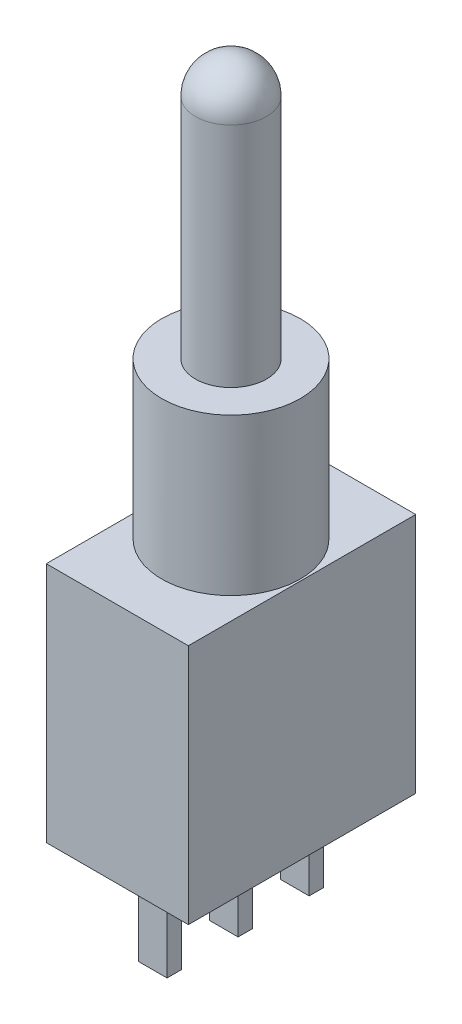
ISO-10303-21;
HEADER;
FILE_DESCRIPTION(('STEP AP214'),'2;1');
FILE_NAME('part.step','',(''),(''),'','','');
FILE_SCHEMA(('AUTOMOTIVE_DESIGN { 1 0 10303 214 1 1 1 1 }'));
ENDSEC;
DATA;
#1=APPLICATION_CONTEXT('core data for automotive mechanical design processes');
#2=APPLICATION_PROTOCOL_DEFINITION('international standard','automotive_design',2000,#1);
#3=PRODUCT_CONTEXT('',#1,'mechanical');
#4=PRODUCT('Part','Part','',(#3));
#5=PRODUCT_RELATED_PRODUCT_CATEGORY('part','',(#4));
#6=PRODUCT_DEFINITION_FORMATION('','',#4);
#7=PRODUCT_DEFINITION_CONTEXT('part definition',#1,'design');
#8=PRODUCT_DEFINITION('design','',#6,#7);
#9=PRODUCT_DEFINITION_SHAPE('','',#8);
#10=(LENGTH_UNIT() NAMED_UNIT(*) SI_UNIT(.MILLI.,.METRE.));
#11=(NAMED_UNIT(*) PLANE_ANGLE_UNIT() SI_UNIT($,.RADIAN.));
#12=(NAMED_UNIT(*) SI_UNIT($,.STERADIAN.) SOLID_ANGLE_UNIT());
#13=UNCERTAINTY_MEASURE_WITH_UNIT(LENGTH_MEASURE(1.E-05),#10,'distance_accuracy_value','');
#14=(GEOMETRIC_REPRESENTATION_CONTEXT(3) GLOBAL_UNCERTAINTY_ASSIGNED_CONTEXT((#13)) GLOBAL_UNIT_ASSIGNED_CONTEXT((#10,
#11,#12)) REPRESENTATION_CONTEXT('',''));
#15=CARTESIAN_POINT('',(0.,0.,0.));
#16=DIRECTION('',(0.,0.,1.));
#17=DIRECTION('',(1.,0.,0.));
#18=AXIS2_PLACEMENT_3D('',#15,#16,#17);
#19=CARTESIAN_POINT('',(0.,0.,0.));
#20=DIRECTION('',(0.,-1.,0.));
#21=DIRECTION('',(0.,0.,-1.));
#22=AXIS2_PLACEMENT_3D('',#19,#20,#21);
#23=PLANE('',#22);
#24=DIRECTION('',(0.,0.,-1.));
#25=VECTOR('',#24,1.);
#26=CARTESIAN_POINT('',(-2.54,0.,4.064));
#27=LINE('',#26,#25);
#28=CARTESIAN_POINT('',(-2.54,0.,4.064));
#29=VERTEX_POINT('',#28);
#30=CARTESIAN_POINT('',(-2.54,0.,-4.064));
#31=VERTEX_POINT('',#30);
#32=EDGE_CURVE('E235',#29,#31,#27,.T.);
#33=ORIENTED_EDGE('',*,*,#32,.T.);
#34=DIRECTION('',(1.,0.,0.));
#35=VECTOR('',#34,1.);
#36=CARTESIAN_POINT('',(-2.54,0.,-4.064));
#37=LINE('',#36,#35);
#38=CARTESIAN_POINT('',(2.54,0.,-4.064));
#39=VERTEX_POINT('',#38);
#40=EDGE_CURVE('E250',#31,#39,#37,.T.);
#41=ORIENTED_EDGE('',*,*,#40,.T.);
#42=DIRECTION('',(0.,0.,-1.));
#43=VECTOR('',#42,1.);
#44=CARTESIAN_POINT('',(2.54,0.,4.064));
#45=LINE('',#44,#43);
#46=CARTESIAN_POINT('',(2.54,0.,4.064));
#47=VERTEX_POINT('',#46);
#48=EDGE_CURVE('E253',#47,#39,#45,.T.);
#49=ORIENTED_EDGE('',*,*,#48,.F.);
#50=DIRECTION('',(1.,0.,0.));
#51=VECTOR('',#50,1.);
#52=CARTESIAN_POINT('',(-2.54,0.,4.064));
#53=LINE('',#52,#51);
#54=EDGE_CURVE('E240',#29,#47,#53,.T.);
#55=ORIENTED_EDGE('',*,*,#54,.F.);
#56=EDGE_LOOP('',(#33,#41,#49,#55));
#57=FACE_BOUND('',#56,.T.);
#58=DIRECTION('',(1.,0.,0.));
#59=VECTOR('',#58,1.);
#60=CARTESIAN_POINT('',(0.508,0.,-0.254));
#61=LINE('',#60,#59);
#62=CARTESIAN_POINT('',(-0.508,0.,-0.254));
#63=VERTEX_POINT('',#62);
#64=CARTESIAN_POINT('',(0.508,0.,-0.254));
#65=VERTEX_POINT('',#64);
#66=EDGE_CURVE('E217',#63,#65,#61,.T.);
#67=ORIENTED_EDGE('',*,*,#66,.F.);
#68=DIRECTION('',(0.,0.,-1.));
#69=VECTOR('',#68,1.);
#70=CARTESIAN_POINT('',(-0.508,0.,0.254));
#71=LINE('',#70,#69);
#72=CARTESIAN_POINT('',(-0.508,0.,0.254));
#73=VERTEX_POINT('',#72);
#74=EDGE_CURVE('E203',#73,#63,#71,.T.);
#75=ORIENTED_EDGE('',*,*,#74,.F.);
#76=DIRECTION('',(-1.,0.,0.));
#77=VECTOR('',#76,1.);
#78=CARTESIAN_POINT('',(0.508,0.,0.254));
#79=LINE('',#78,#77);
#80=CARTESIAN_POINT('',(0.508,0.,0.254));
#81=VERTEX_POINT('',#80);
#82=EDGE_CURVE('E208',#81,#73,#79,.T.);
#83=ORIENTED_EDGE('',*,*,#82,.F.);
#84=DIRECTION('',(0.,0.,1.));
#85=VECTOR('',#84,1.);
#86=CARTESIAN_POINT('',(0.508,0.,0.254));
#87=LINE('',#86,#85);
#88=EDGE_CURVE('E219',#65,#81,#87,.T.);
#89=ORIENTED_EDGE('',*,*,#88,.F.);
#90=EDGE_LOOP('',(#67,#75,#83,#89));
#91=FACE_BOUND('',#90,.T.);
#92=DIRECTION('',(1.,0.,0.));
#93=VECTOR('',#92,1.);
#94=CARTESIAN_POINT('',(0.508,0.,-2.794));
#95=LINE('',#94,#93);
#96=CARTESIAN_POINT('',(-0.508,0.,-2.794));
#97=VERTEX_POINT('',#96);
#98=CARTESIAN_POINT('',(0.508,0.,-2.794));
#99=VERTEX_POINT('',#98);
#100=EDGE_CURVE('E175',#97,#99,#95,.T.);
#101=ORIENTED_EDGE('',*,*,#100,.F.);
#102=DIRECTION('',(0.,0.,-1.));
#103=VECTOR('',#102,1.);
#104=CARTESIAN_POINT('',(-0.508,0.,-2.286));
#105=LINE('',#104,#103);
#106=CARTESIAN_POINT('',(-0.508,0.,-2.286));
#107=VERTEX_POINT('',#106);
#108=EDGE_CURVE('E172',#107,#97,#105,.T.);
#109=ORIENTED_EDGE('',*,*,#108,.F.);
#110=DIRECTION('',(-1.,0.,0.));
#111=VECTOR('',#110,1.);
#112=CARTESIAN_POINT('',(0.508,0.,-2.286));
#113=LINE('',#112,#111);
#114=CARTESIAN_POINT('',(0.508,0.,-2.286));
#115=VERTEX_POINT('',#114);
#116=EDGE_CURVE('E184',#115,#107,#113,.T.);
#117=ORIENTED_EDGE('',*,*,#116,.F.);
#118=DIRECTION('',(0.,0.,1.));
#119=VECTOR('',#118,1.);
#120=CARTESIAN_POINT('',(0.508,0.,-2.286));
#121=LINE('',#120,#119);
#122=EDGE_CURVE('E192',#99,#115,#121,.T.);
#123=ORIENTED_EDGE('',*,*,#122,.F.);
#124=EDGE_LOOP('',(#101,#109,#117,#123));
#125=FACE_BOUND('',#124,.T.);
#126=DIRECTION('',(1.,0.,0.));
#127=VECTOR('',#126,1.);
#128=CARTESIAN_POINT('',(0.508,0.,2.286));
#129=LINE('',#128,#127);
#130=CARTESIAN_POINT('',(-0.508,0.,2.286));
#131=VERTEX_POINT('',#130);
#132=CARTESIAN_POINT('',(0.508,0.,2.286));
#133=VERTEX_POINT('',#132);
#134=EDGE_CURVE('E304',#131,#133,#129,.T.);
#135=ORIENTED_EDGE('',*,*,#134,.F.);
#136=DIRECTION('',(0.,0.,-1.));
#137=VECTOR('',#136,1.);
#138=CARTESIAN_POINT('',(-0.508,0.,2.286));
#139=LINE('',#138,#137);
#140=CARTESIAN_POINT('',(-0.508,0.,2.794));
#141=VERTEX_POINT('',#140);
#142=EDGE_CURVE('E170',#141,#131,#139,.T.);
#143=ORIENTED_EDGE('',*,*,#142,.F.);
#144=DIRECTION('',(-1.,0.,0.));
#145=VECTOR('',#144,1.);
#146=CARTESIAN_POINT('',(0.508,0.,2.794));
#147=LINE('',#146,#145);
#148=CARTESIAN_POINT('',(0.508,0.,2.794));
#149=VERTEX_POINT('',#148);
#150=EDGE_CURVE('E166',#149,#141,#147,.T.);
#151=ORIENTED_EDGE('',*,*,#150,.F.);
#152=DIRECTION('',(0.,0.,1.));
#153=VECTOR('',#152,1.);
#154=CARTESIAN_POINT('',(0.508,0.,2.286));
#155=LINE('',#154,#153);
#156=EDGE_CURVE('E306',#133,#149,#155,.T.);
#157=ORIENTED_EDGE('',*,*,#156,.F.);
#158=EDGE_LOOP('',(#135,#143,#151,#157));
#159=FACE_BOUND('',#158,.T.);
#160=ADVANCED_FACE('F33',(#57,#91,#125,#159),#23,.T.);
#161=CARTESIAN_POINT('',(-2.54,8.636,4.064));
#162=DIRECTION('',(-1.,0.,0.));
#163=DIRECTION('',(0.,0.,1.));
#164=AXIS2_PLACEMENT_3D('',#161,#162,#163);
#165=PLANE('',#164);
#166=ORIENTED_EDGE('',*,*,#32,.F.);
#167=DIRECTION('',(0.,-1.,0.));
#168=VECTOR('',#167,1.);
#169=CARTESIAN_POINT('',(-2.54,8.636,4.064));
#170=LINE('',#169,#168);
#171=CARTESIAN_POINT('',(-2.54,8.636,4.064));
#172=VERTEX_POINT('',#171);
#173=EDGE_CURVE('E257',#172,#29,#170,.T.);
#174=ORIENTED_EDGE('',*,*,#173,.F.);
#175=DIRECTION('',(0.,0.,-1.));
#176=VECTOR('',#175,1.);
#177=CARTESIAN_POINT('',(-2.54,8.636,4.064));
#178=LINE('',#177,#176);
#179=CARTESIAN_POINT('',(-2.54,8.636,-4.064));
#180=VERTEX_POINT('',#179);
#181=EDGE_CURVE('E236',#172,#180,#178,.T.);
#182=ORIENTED_EDGE('',*,*,#181,.T.);
#183=DIRECTION('',(0.,-1.,0.));
#184=VECTOR('',#183,1.);
#185=CARTESIAN_POINT('',(-2.54,8.636,-4.064));
#186=LINE('',#185,#184);
#187=EDGE_CURVE('E247',#180,#31,#186,.T.);
#188=ORIENTED_EDGE('',*,*,#187,.T.);
#189=EDGE_LOOP('',(#166,#174,#182,#188));
#190=FACE_BOUND('',#189,.T.);
#191=ADVANCED_FACE('F280',(#190),#165,.T.);
#192=CARTESIAN_POINT('',(-2.54,8.636,4.064));
#193=DIRECTION('',(0.,0.,-1.));
#194=DIRECTION('',(-1.,0.,0.));
#195=AXIS2_PLACEMENT_3D('',#192,#193,#194);
#196=PLANE('',#195);
#197=ORIENTED_EDGE('',*,*,#54,.T.);
#198=DIRECTION('',(0.,-1.,0.));
#199=VECTOR('',#198,1.);
#200=CARTESIAN_POINT('',(2.54,8.636,4.064));
#201=LINE('',#200,#199);
#202=CARTESIAN_POINT('',(2.54,8.636,4.064));
#203=VERTEX_POINT('',#202);
#204=EDGE_CURVE('E259',#203,#47,#201,.T.);
#205=ORIENTED_EDGE('',*,*,#204,.F.);
#206=DIRECTION('',(1.,0.,0.));
#207=VECTOR('',#206,1.);
#208=CARTESIAN_POINT('',(-2.54,8.636,4.064));
#209=LINE('',#208,#207);
#210=EDGE_CURVE('E245',#172,#203,#209,.T.);
#211=ORIENTED_EDGE('',*,*,#210,.F.);
#212=ORIENTED_EDGE('',*,*,#173,.T.);
#213=EDGE_LOOP('',(#197,#205,#211,#212));
#214=FACE_BOUND('',#213,.T.);
#215=ADVANCED_FACE('F284',(#214),#196,.F.);
#216=CARTESIAN_POINT('',(2.54,8.636,4.064));
#217=DIRECTION('',(-1.,0.,0.));
#218=DIRECTION('',(0.,0.,1.));
#219=AXIS2_PLACEMENT_3D('',#216,#217,#218);
#220=PLANE('',#219);
#221=ORIENTED_EDGE('',*,*,#48,.T.);
#222=DIRECTION('',(0.,-1.,0.));
#223=VECTOR('',#222,1.);
#224=CARTESIAN_POINT('',(2.54,8.636,-4.064));
#225=LINE('',#224,#223);
#226=CARTESIAN_POINT('',(2.54,8.636,-4.064));
#227=VERTEX_POINT('',#226);
#228=EDGE_CURVE('E262',#227,#39,#225,.T.);
#229=ORIENTED_EDGE('',*,*,#228,.F.);
#230=DIRECTION('',(0.,0.,-1.));
#231=VECTOR('',#230,1.);
#232=CARTESIAN_POINT('',(2.54,8.636,4.064));
#233=LINE('',#232,#231);
#234=EDGE_CURVE('E243',#203,#227,#233,.T.);
#235=ORIENTED_EDGE('',*,*,#234,.F.);
#236=ORIENTED_EDGE('',*,*,#204,.T.);
#237=EDGE_LOOP('',(#221,#229,#235,#236));
#238=FACE_BOUND('',#237,.T.);
#239=ADVANCED_FACE('F289',(#238),#220,.F.);
#240=CARTESIAN_POINT('',(-2.54,8.636,-4.064));
#241=DIRECTION('',(0.,0.,-1.));
#242=DIRECTION('',(-1.,0.,0.));
#243=AXIS2_PLACEMENT_3D('',#240,#241,#242);
#244=PLANE('',#243);
#245=ORIENTED_EDGE('',*,*,#40,.F.);
#246=ORIENTED_EDGE('',*,*,#187,.F.);
#247=DIRECTION('',(1.,0.,0.));
#248=VECTOR('',#247,1.);
#249=CARTESIAN_POINT('',(-2.54,8.636,-4.064));
#250=LINE('',#249,#248);
#251=EDGE_CURVE('E239',#180,#227,#250,.T.);
#252=ORIENTED_EDGE('',*,*,#251,.T.);
#253=ORIENTED_EDGE('',*,*,#228,.T.);
#254=EDGE_LOOP('',(#245,#246,#252,#253));
#255=FACE_BOUND('',#254,.T.);
#256=ADVANCED_FACE('F272',(#255),#244,.T.);
#257=CARTESIAN_POINT('',(0.,8.636,0.));
#258=DIRECTION('',(0.,-1.,0.));
#259=DIRECTION('',(0.,0.,-1.));
#260=AXIS2_PLACEMENT_3D('',#257,#258,#259);
#261=PLANE('',#260);
#262=CARTESIAN_POINT('',(0.,8.636,0.));
#263=DIRECTION('',(0.,-1.,0.));
#264=DIRECTION('',(0.,0.,-1.));
#265=AXIS2_PLACEMENT_3D('',#262,#263,#264);
#266=CIRCLE('',#265,2.4765);
#267=CARTESIAN_POINT('',(0.,8.636,-2.4765));
#268=VERTEX_POINT('',#267);
#269=EDGE_CURVE('E41',#268,#268,#266,.F.);
#270=ORIENTED_EDGE('',*,*,#269,.F.);
#271=EDGE_LOOP('',(#270));
#272=FACE_BOUND('',#271,.T.);
#273=ORIENTED_EDGE('',*,*,#181,.F.);
#274=ORIENTED_EDGE('',*,*,#210,.T.);
#275=ORIENTED_EDGE('',*,*,#234,.T.);
#276=ORIENTED_EDGE('',*,*,#251,.F.);
#277=EDGE_LOOP('',(#273,#274,#275,#276));
#278=FACE_BOUND('',#277,.T.);
#279=ADVANCED_FACE('F269',(#272,#278),#261,.F.);
#280=CARTESIAN_POINT('',(0.,14.224,0.));
#281=DIRECTION('',(0.,-1.,0.));
#282=DIRECTION('',(0.,0.,-1.));
#283=AXIS2_PLACEMENT_3D('',#280,#281,#282);
#284=CYLINDRICAL_SURFACE('',#283,2.4765);
#285=CARTESIAN_POINT('',(0.,14.224,0.));
#286=DIRECTION('',(0.,1.,0.));
#287=DIRECTION('',(0.,0.,1.));
#288=AXIS2_PLACEMENT_3D('',#285,#286,#287);
#289=CIRCLE('',#288,2.4765);
#290=CARTESIAN_POINT('',(0.,14.224,2.4765));
#291=VERTEX_POINT('',#290);
#292=EDGE_CURVE('E232',#291,#291,#289,.T.);
#293=ORIENTED_EDGE('',*,*,#292,.F.);
#294=EDGE_LOOP('',(#293));
#295=FACE_BOUND('',#294,.T.);
#296=ORIENTED_EDGE('',*,*,#269,.T.);
#297=EDGE_LOOP('',(#296));
#298=FACE_BOUND('',#297,.T.);
#299=ADVANCED_FACE('F267',(#295,#298),#284,.T.);
#300=CARTESIAN_POINT('',(0.,14.224,0.));
#301=DIRECTION('',(0.,1.,0.));
#302=DIRECTION('',(0.,0.,1.));
#303=AXIS2_PLACEMENT_3D('',#300,#301,#302);
#304=PLANE('',#303);
#305=CARTESIAN_POINT('',(0.,14.224,0.));
#306=DIRECTION('',(0.,1.,0.));
#307=DIRECTION('',(0.,0.,1.));
#308=AXIS2_PLACEMENT_3D('',#305,#306,#307);
#309=CIRCLE('',#308,1.27);
#310=CARTESIAN_POINT('',(0.,14.224,1.27));
#311=VERTEX_POINT('',#310);
#312=EDGE_CURVE('E309',#311,#311,#309,.T.);
#313=ORIENTED_EDGE('',*,*,#312,.F.);
#314=EDGE_LOOP('',(#313));
#315=FACE_BOUND('',#314,.T.);
#316=ORIENTED_EDGE('',*,*,#292,.T.);
#317=EDGE_LOOP('',(#316));
#318=FACE_BOUND('',#317,.T.);
#319=ADVANCED_FACE('F322',(#315,#318),#304,.T.);
#320=CARTESIAN_POINT('',(-0.508,-3.302,0.254));
#321=DIRECTION('',(1.,0.,0.));
#322=DIRECTION('',(0.,0.,-1.));
#323=AXIS2_PLACEMENT_3D('',#320,#321,#322);
#324=PLANE('',#323);
#325=ORIENTED_EDGE('',*,*,#74,.T.);
#326=DIRECTION('',(0.,1.,0.));
#327=VECTOR('',#326,1.);
#328=CARTESIAN_POINT('',(-0.508,-3.302,-0.254));
#329=LINE('',#328,#327);
#330=CARTESIAN_POINT('',(-0.508,-3.302,-0.254));
#331=VERTEX_POINT('',#330);
#332=EDGE_CURVE('E230',#331,#63,#329,.T.);
#333=ORIENTED_EDGE('',*,*,#332,.F.);
#334=DIRECTION('',(0.,0.,-1.));
#335=VECTOR('',#334,1.);
#336=CARTESIAN_POINT('',(-0.508,-3.302,0.254));
#337=LINE('',#336,#335);
#338=CARTESIAN_POINT('',(-0.508,-3.302,0.254));
#339=VERTEX_POINT('',#338);
#340=EDGE_CURVE('E204',#339,#331,#337,.T.);
#341=ORIENTED_EDGE('',*,*,#340,.F.);
#342=DIRECTION('',(0.,1.,0.));
#343=VECTOR('',#342,1.);
#344=CARTESIAN_POINT('',(-0.508,-3.302,0.254));
#345=LINE('',#344,#343);
#346=EDGE_CURVE('E214',#339,#73,#345,.T.);
#347=ORIENTED_EDGE('',*,*,#346,.T.);
#348=EDGE_LOOP('',(#325,#333,#341,#347));
#349=FACE_BOUND('',#348,.T.);
#350=ADVANCED_FACE('F325',(#349),#324,.F.);
#351=CARTESIAN_POINT('',(0.508,-3.302,-0.254));
#352=DIRECTION('',(0.,0.,1.));
#353=DIRECTION('',(1.,0.,0.));
#354=AXIS2_PLACEMENT_3D('',#351,#352,#353);
#355=PLANE('',#354);
#356=ORIENTED_EDGE('',*,*,#66,.T.);
#357=DIRECTION('',(0.,1.,0.));
#358=VECTOR('',#357,1.);
#359=CARTESIAN_POINT('',(0.508,-3.302,-0.254));
#360=LINE('',#359,#358);
#361=CARTESIAN_POINT('',(0.508,-3.302,-0.254));
#362=VERTEX_POINT('',#361);
#363=EDGE_CURVE('E227',#362,#65,#360,.T.);
#364=ORIENTED_EDGE('',*,*,#363,.F.);
#365=DIRECTION('',(1.,0.,0.));
#366=VECTOR('',#365,1.);
#367=CARTESIAN_POINT('',(0.508,-3.302,-0.254));
#368=LINE('',#367,#366);
#369=EDGE_CURVE('E207',#331,#362,#368,.T.);
#370=ORIENTED_EDGE('',*,*,#369,.F.);
#371=ORIENTED_EDGE('',*,*,#332,.T.);
#372=EDGE_LOOP('',(#356,#364,#370,#371));
#373=FACE_BOUND('',#372,.T.);
#374=ADVANCED_FACE('F379',(#373),#355,.F.);
#375=CARTESIAN_POINT('',(0.508,-3.302,0.254));
#376=DIRECTION('',(-1.,0.,0.));
#377=DIRECTION('',(0.,0.,1.));
#378=AXIS2_PLACEMENT_3D('',#375,#376,#377);
#379=PLANE('',#378);
#380=ORIENTED_EDGE('',*,*,#88,.T.);
#381=DIRECTION('',(0.,1.,0.));
#382=VECTOR('',#381,1.);
#383=CARTESIAN_POINT('',(0.508,-3.302,0.254));
#384=LINE('',#383,#382);
#385=CARTESIAN_POINT('',(0.508,-3.302,0.254));
#386=VERTEX_POINT('',#385);
#387=EDGE_CURVE('E225',#386,#81,#384,.T.);
#388=ORIENTED_EDGE('',*,*,#387,.F.);
#389=DIRECTION('',(0.,0.,1.));
#390=VECTOR('',#389,1.);
#391=CARTESIAN_POINT('',(0.508,-3.302,0.254));
#392=LINE('',#391,#390);
#393=EDGE_CURVE('E210',#362,#386,#392,.T.);
#394=ORIENTED_EDGE('',*,*,#393,.F.);
#395=ORIENTED_EDGE('',*,*,#363,.T.);
#396=EDGE_LOOP('',(#380,#388,#394,#395));
#397=FACE_BOUND('',#396,.T.);
#398=ADVANCED_FACE('F388',(#397),#379,.F.);
#399=CARTESIAN_POINT('',(0.508,-3.302,0.254));
#400=DIRECTION('',(0.,0.,-1.));
#401=DIRECTION('',(-1.,0.,0.));
#402=AXIS2_PLACEMENT_3D('',#399,#400,#401);
#403=PLANE('',#402);
#404=ORIENTED_EDGE('',*,*,#82,.T.);
#405=ORIENTED_EDGE('',*,*,#346,.F.);
#406=DIRECTION('',(-1.,0.,0.));
#407=VECTOR('',#406,1.);
#408=CARTESIAN_POINT('',(0.508,-3.302,0.254));
#409=LINE('',#408,#407);
#410=EDGE_CURVE('E212',#386,#339,#409,.T.);
#411=ORIENTED_EDGE('',*,*,#410,.F.);
#412=ORIENTED_EDGE('',*,*,#387,.T.);
#413=EDGE_LOOP('',(#404,#405,#411,#412));
#414=FACE_BOUND('',#413,.T.);
#415=ADVANCED_FACE('F398',(#414),#403,.F.);
#416=CARTESIAN_POINT('',(0.,-3.302,0.));
#417=DIRECTION('',(0.,1.,0.));
#418=DIRECTION('',(0.,0.,1.));
#419=AXIS2_PLACEMENT_3D('',#416,#417,#418);
#420=PLANE('',#419);
#421=ORIENTED_EDGE('',*,*,#340,.T.);
#422=ORIENTED_EDGE('',*,*,#369,.T.);
#423=ORIENTED_EDGE('',*,*,#393,.T.);
#424=ORIENTED_EDGE('',*,*,#410,.T.);
#425=EDGE_LOOP('',(#421,#422,#423,#424));
#426=FACE_BOUND('',#425,.T.);
#427=ADVANCED_FACE('F408',(#426),#420,.F.);
#428=CARTESIAN_POINT('',(-0.508,-3.302,-2.286));
#429=DIRECTION('',(1.,0.,0.));
#430=DIRECTION('',(0.,0.,-1.));
#431=AXIS2_PLACEMENT_3D('',#428,#429,#430);
#432=PLANE('',#431);
#433=ORIENTED_EDGE('',*,*,#108,.T.);
#434=DIRECTION('',(0.,1.,0.));
#435=VECTOR('',#434,1.);
#436=CARTESIAN_POINT('',(-0.508,-3.302,-2.794));
#437=LINE('',#436,#435);
#438=CARTESIAN_POINT('',(-0.508,-3.302,-2.794));
#439=VERTEX_POINT('',#438);
#440=EDGE_CURVE('E201',#439,#97,#437,.T.);
#441=ORIENTED_EDGE('',*,*,#440,.F.);
#442=DIRECTION('',(0.,0.,-1.));
#443=VECTOR('',#442,1.);
#444=CARTESIAN_POINT('',(-0.508,-3.302,-2.286));
#445=LINE('',#444,#443);
#446=CARTESIAN_POINT('',(-0.508,-3.302,-2.286));
#447=VERTEX_POINT('',#446);
#448=EDGE_CURVE('E180',#447,#439,#445,.T.);
#449=ORIENTED_EDGE('',*,*,#448,.F.);
#450=DIRECTION('',(0.,1.,0.));
#451=VECTOR('',#450,1.);
#452=CARTESIAN_POINT('',(-0.508,-3.302,-2.286));
#453=LINE('',#452,#451);
#454=EDGE_CURVE('E189',#447,#107,#453,.T.);
#455=ORIENTED_EDGE('',*,*,#454,.T.);
#456=EDGE_LOOP('',(#433,#441,#449,#455));
#457=FACE_BOUND('',#456,.T.);
#458=ADVANCED_FACE('F418',(#457),#432,.F.);
#459=CARTESIAN_POINT('',(0.508,-3.302,-2.794));
#460=DIRECTION('',(0.,0.,1.));
#461=DIRECTION('',(1.,0.,0.));
#462=AXIS2_PLACEMENT_3D('',#459,#460,#461);
#463=PLANE('',#462);
#464=ORIENTED_EDGE('',*,*,#100,.T.);
#465=DIRECTION('',(0.,1.,0.));
#466=VECTOR('',#465,1.);
#467=CARTESIAN_POINT('',(0.508,-3.302,-2.794));
#468=LINE('',#467,#466);
#469=CARTESIAN_POINT('',(0.508,-3.302,-2.794));
#470=VERTEX_POINT('',#469);
#471=EDGE_CURVE('E198',#470,#99,#468,.T.);
#472=ORIENTED_EDGE('',*,*,#471,.F.);
#473=DIRECTION('',(1.,0.,0.));
#474=VECTOR('',#473,1.);
#475=CARTESIAN_POINT('',(0.508,-3.302,-2.794));
#476=LINE('',#475,#474);
#477=EDGE_CURVE('E183',#439,#470,#476,.T.);
#478=ORIENTED_EDGE('',*,*,#477,.F.);
#479=ORIENTED_EDGE('',*,*,#440,.T.);
#480=EDGE_LOOP('',(#464,#472,#478,#479));
#481=FACE_BOUND('',#480,.T.);
#482=ADVANCED_FACE('F428',(#481),#463,.F.);
#483=CARTESIAN_POINT('',(0.508,-3.302,-2.286));
#484=DIRECTION('',(-1.,0.,0.));
#485=DIRECTION('',(0.,0.,1.));
#486=AXIS2_PLACEMENT_3D('',#483,#484,#485);
#487=PLANE('',#486);
#488=ORIENTED_EDGE('',*,*,#122,.T.);
#489=DIRECTION('',(0.,1.,0.));
#490=VECTOR('',#489,1.);
#491=CARTESIAN_POINT('',(0.508,-3.302,-2.286));
#492=LINE('',#491,#490);
#493=CARTESIAN_POINT('',(0.508,-3.302,-2.286));
#494=VERTEX_POINT('',#493);
#495=EDGE_CURVE('E56',#494,#115,#492,.T.);
#496=ORIENTED_EDGE('',*,*,#495,.F.);
#497=DIRECTION('',(0.,0.,1.));
#498=VECTOR('',#497,1.);
#499=CARTESIAN_POINT('',(0.508,-3.302,-2.286));
#500=LINE('',#499,#498);
#501=EDGE_CURVE('E186',#470,#494,#500,.T.);
#502=ORIENTED_EDGE('',*,*,#501,.F.);
#503=ORIENTED_EDGE('',*,*,#471,.T.);
#504=EDGE_LOOP('',(#488,#496,#502,#503));
#505=FACE_BOUND('',#504,.T.);
#506=ADVANCED_FACE('F438',(#505),#487,.F.);
#507=CARTESIAN_POINT('',(0.508,-3.302,-2.286));
#508=DIRECTION('',(0.,0.,-1.));
#509=DIRECTION('',(-1.,0.,0.));
#510=AXIS2_PLACEMENT_3D('',#507,#508,#509);
#511=PLANE('',#510);
#512=ORIENTED_EDGE('',*,*,#116,.T.);
#513=ORIENTED_EDGE('',*,*,#454,.F.);
#514=DIRECTION('',(-1.,0.,0.));
#515=VECTOR('',#514,1.);
#516=CARTESIAN_POINT('',(0.508,-3.302,-2.286));
#517=LINE('',#516,#515);
#518=EDGE_CURVE('E188',#494,#447,#517,.T.);
#519=ORIENTED_EDGE('',*,*,#518,.F.);
#520=ORIENTED_EDGE('',*,*,#495,.T.);
#521=EDGE_LOOP('',(#512,#513,#519,#520));
#522=FACE_BOUND('',#521,.T.);
#523=ADVANCED_FACE('F448',(#522),#511,.F.);
#524=CARTESIAN_POINT('',(0.,-3.302,0.));
#525=DIRECTION('',(0.,1.,0.));
#526=DIRECTION('',(0.,0.,1.));
#527=AXIS2_PLACEMENT_3D('',#524,#525,#526);
#528=PLANE('',#527);
#529=ORIENTED_EDGE('',*,*,#448,.T.);
#530=ORIENTED_EDGE('',*,*,#477,.T.);
#531=ORIENTED_EDGE('',*,*,#501,.T.);
#532=ORIENTED_EDGE('',*,*,#518,.T.);
#533=EDGE_LOOP('',(#529,#530,#531,#532));
#534=FACE_BOUND('',#533,.T.);
#535=ADVANCED_FACE('F458',(#534),#528,.F.);
#536=CARTESIAN_POINT('',(-0.508,-3.302,2.286));
#537=DIRECTION('',(1.,0.,0.));
#538=DIRECTION('',(0.,0.,-1.));
#539=AXIS2_PLACEMENT_3D('',#536,#537,#538);
#540=PLANE('',#539);
#541=ORIENTED_EDGE('',*,*,#142,.T.);
#542=DIRECTION('',(0.,1.,0.));
#543=VECTOR('',#542,1.);
#544=CARTESIAN_POINT('',(-0.508,-3.302,2.286));
#545=LINE('',#544,#543);
#546=CARTESIAN_POINT('',(-0.508,-3.302,2.286));
#547=VERTEX_POINT('',#546);
#548=EDGE_CURVE('E151',#547,#131,#545,.T.);
#549=ORIENTED_EDGE('',*,*,#548,.F.);
#550=DIRECTION('',(0.,0.,-1.));
#551=VECTOR('',#550,1.);
#552=CARTESIAN_POINT('',(-0.508,-3.302,2.286));
#553=LINE('',#552,#551);
#554=CARTESIAN_POINT('',(-0.508,-3.302,2.794));
#555=VERTEX_POINT('',#554);
#556=EDGE_CURVE('E158',#555,#547,#553,.T.);
#557=ORIENTED_EDGE('',*,*,#556,.F.);
#558=DIRECTION('',(0.,1.,0.));
#559=VECTOR('',#558,1.);
#560=CARTESIAN_POINT('',(-0.508,-3.302,2.794));
#561=LINE('',#560,#559);
#562=EDGE_CURVE('E314',#555,#141,#561,.T.);
#563=ORIENTED_EDGE('',*,*,#562,.T.);
#564=EDGE_LOOP('',(#541,#549,#557,#563));
#565=FACE_BOUND('',#564,.T.);
#566=ADVANCED_FACE('F168',(#565),#540,.F.);
#567=CARTESIAN_POINT('',(0.508,-3.302,2.286));
#568=DIRECTION('',(0.,0.,1.));
#569=DIRECTION('',(1.,0.,0.));
#570=AXIS2_PLACEMENT_3D('',#567,#568,#569);
#571=PLANE('',#570);
#572=ORIENTED_EDGE('',*,*,#134,.T.);
#573=DIRECTION('',(0.,1.,0.));
#574=VECTOR('',#573,1.);
#575=CARTESIAN_POINT('',(0.508,-3.302,2.286));
#576=LINE('',#575,#574);
#577=CARTESIAN_POINT('',(0.508,-3.302,2.286));
#578=VERTEX_POINT('',#577);
#579=EDGE_CURVE('E154',#578,#133,#576,.T.);
#580=ORIENTED_EDGE('',*,*,#579,.F.);
#581=DIRECTION('',(1.,0.,0.));
#582=VECTOR('',#581,1.);
#583=CARTESIAN_POINT('',(0.508,-3.302,2.286));
#584=LINE('',#583,#582);
#585=EDGE_CURVE('E147',#547,#578,#584,.T.);
#586=ORIENTED_EDGE('',*,*,#585,.F.);
#587=ORIENTED_EDGE('',*,*,#548,.T.);
#588=EDGE_LOOP('',(#572,#580,#586,#587));
#589=FACE_BOUND('',#588,.T.);
#590=ADVANCED_FACE('F149',(#589),#571,.F.);
#591=CARTESIAN_POINT('',(0.508,-3.302,2.286));
#592=DIRECTION('',(-1.,0.,0.));
#593=DIRECTION('',(0.,0.,1.));
#594=AXIS2_PLACEMENT_3D('',#591,#592,#593);
#595=PLANE('',#594);
#596=ORIENTED_EDGE('',*,*,#156,.T.);
#597=DIRECTION('',(0.,1.,0.));
#598=VECTOR('',#597,1.);
#599=CARTESIAN_POINT('',(0.508,-3.302,2.794));
#600=LINE('',#599,#598);
#601=CARTESIAN_POINT('',(0.508,-3.302,2.794));
#602=VERTEX_POINT('',#601);
#603=EDGE_CURVE('E48',#602,#149,#600,.T.);
#604=ORIENTED_EDGE('',*,*,#603,.F.);
#605=DIRECTION('',(0.,0.,1.));
#606=VECTOR('',#605,1.);
#607=CARTESIAN_POINT('',(0.508,-3.302,2.286));
#608=LINE('',#607,#606);
#609=EDGE_CURVE('E157',#578,#602,#608,.T.);
#610=ORIENTED_EDGE('',*,*,#609,.F.);
#611=ORIENTED_EDGE('',*,*,#579,.T.);
#612=EDGE_LOOP('',(#596,#604,#610,#611));
#613=FACE_BOUND('',#612,.T.);
#614=ADVANCED_FACE('F484',(#613),#595,.F.);
#615=CARTESIAN_POINT('',(0.508,-3.302,2.794));
#616=DIRECTION('',(0.,0.,-1.));
#617=DIRECTION('',(-1.,0.,0.));
#618=AXIS2_PLACEMENT_3D('',#615,#616,#617);
#619=PLANE('',#618);
#620=ORIENTED_EDGE('',*,*,#150,.T.);
#621=ORIENTED_EDGE('',*,*,#562,.F.);
#622=DIRECTION('',(-1.,0.,0.));
#623=VECTOR('',#622,1.);
#624=CARTESIAN_POINT('',(0.508,-3.302,2.794));
#625=LINE('',#624,#623);
#626=EDGE_CURVE('E162',#602,#555,#625,.T.);
#627=ORIENTED_EDGE('',*,*,#626,.F.);
#628=ORIENTED_EDGE('',*,*,#603,.T.);
#629=EDGE_LOOP('',(#620,#621,#627,#628));
#630=FACE_BOUND('',#629,.T.);
#631=ADVANCED_FACE('F493',(#630),#619,.F.);
#632=CARTESIAN_POINT('',(0.,-3.302,0.));
#633=DIRECTION('',(0.,-1.,0.));
#634=DIRECTION('',(0.,0.,-1.));
#635=AXIS2_PLACEMENT_3D('',#632,#633,#634);
#636=PLANE('',#635);
#637=ORIENTED_EDGE('',*,*,#556,.T.);
#638=ORIENTED_EDGE('',*,*,#585,.T.);
#639=ORIENTED_EDGE('',*,*,#609,.T.);
#640=ORIENTED_EDGE('',*,*,#626,.T.);
#641=EDGE_LOOP('',(#637,#638,#639,#640));
#642=FACE_BOUND('',#641,.T.);
#643=ADVANCED_FACE('F161',(#642),#636,.T.);
#644=CARTESIAN_POINT('',(0.,23.622,0.));
#645=DIRECTION('',(0.,-1.,0.));
#646=DIRECTION('',(0.,0.,-1.));
#647=AXIS2_PLACEMENT_3D('',#644,#645,#646);
#648=CYLINDRICAL_SURFACE('',#647,1.27);
#649=CARTESIAN_POINT('',(0.,22.352,0.));
#650=DIRECTION('',(0.,-1.,0.));
#651=DIRECTION('',(0.,0.,-1.));
#652=AXIS2_PLACEMENT_3D('',#649,#650,#651);
#653=CIRCLE('',#652,1.27);
#654=CARTESIAN_POINT('',(0.,22.352,-1.27));
#655=VERTEX_POINT('',#654);
#656=EDGE_CURVE('E11',#655,#655,#653,.T.);
#657=ORIENTED_EDGE('',*,*,#656,.T.);
#658=EDGE_LOOP('',(#657));
#659=FACE_BOUND('',#658,.T.);
#660=ORIENTED_EDGE('',*,*,#312,.T.);
#661=EDGE_LOOP('',(#660));
#662=FACE_BOUND('',#661,.T.);
#663=ADVANCED_FACE('F320',(#659,#662),#648,.T.);
#664=CARTESIAN_POINT('',(0.,22.352,0.));
#665=DIRECTION('',(0.,1.,0.));
#666=DIRECTION('',(0.,0.,1.));
#667=AXIS2_PLACEMENT_3D('',#664,#665,#666);
#668=SPHERICAL_SURFACE('',#667,1.27);
#669=ORIENTED_EDGE('',*,*,#656,.F.);
#670=EDGE_LOOP('',(#669));
#671=FACE_BOUND('',#670,.T.);
#672=ADVANCED_FACE('F35',(#671),#668,.T.);
#673=CLOSED_SHELL('',(#160,#191,#215,#239,#256,#279,#299,#319,#350,#374,#398,#415,#427,#458,
#482,#506,#523,#535,#566,#590,#614,#631,#643,#663,#672));
#674=MANIFOLD_SOLID_BREP('B2',#673);
#675=ADVANCED_BREP_SHAPE_REPRESENTATION('',(#18,#674),#14);
#676=SHAPE_DEFINITION_REPRESENTATION(#9,#675);
ENDSEC;
END-ISO-10303-21;
